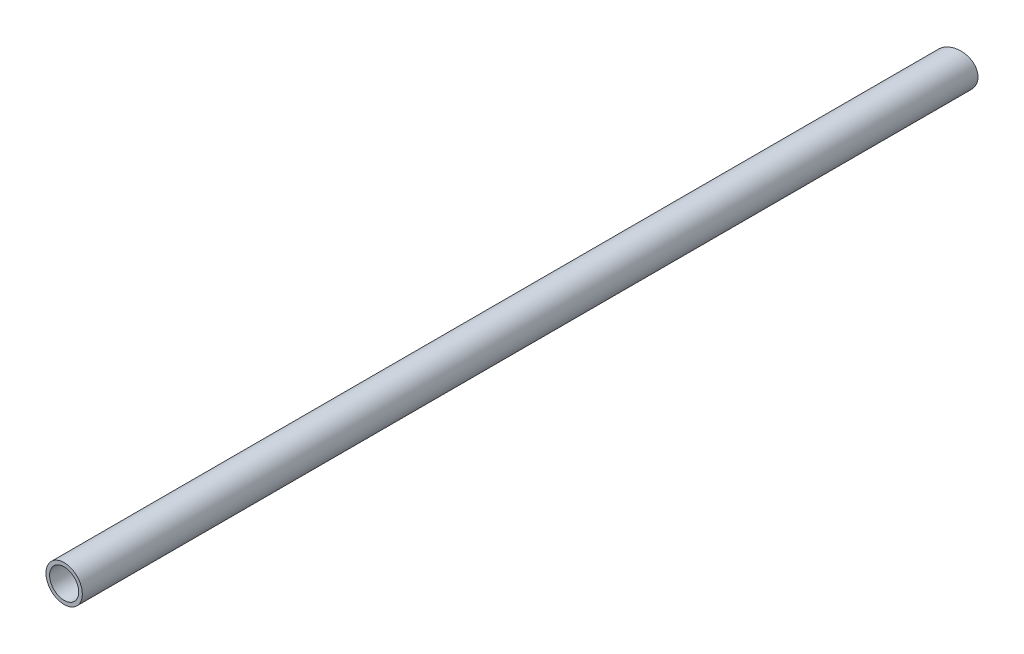
ISO-10303-21;
HEADER;
FILE_DESCRIPTION(('STEP AP214'),'2;1');
FILE_NAME('part.step','',(''),(''),'','','');
FILE_SCHEMA(('AUTOMOTIVE_DESIGN { 1 0 10303 214 1 1 1 1 }'));
ENDSEC;
DATA;
#1=APPLICATION_CONTEXT('core data for automotive mechanical design processes');
#2=APPLICATION_PROTOCOL_DEFINITION('international standard','automotive_design',2000,#1);
#3=PRODUCT_CONTEXT('',#1,'mechanical');
#4=PRODUCT('Part','Part','',(#3));
#5=PRODUCT_RELATED_PRODUCT_CATEGORY('part','',(#4));
#6=PRODUCT_DEFINITION_FORMATION('','',#4);
#7=PRODUCT_DEFINITION_CONTEXT('part definition',#1,'design');
#8=PRODUCT_DEFINITION('design','',#6,#7);
#9=PRODUCT_DEFINITION_SHAPE('','',#8);
#10=(LENGTH_UNIT() NAMED_UNIT(*) SI_UNIT(.MILLI.,.METRE.));
#11=(NAMED_UNIT(*) PLANE_ANGLE_UNIT() SI_UNIT($,.RADIAN.));
#12=(NAMED_UNIT(*) SI_UNIT($,.STERADIAN.) SOLID_ANGLE_UNIT());
#13=UNCERTAINTY_MEASURE_WITH_UNIT(LENGTH_MEASURE(1.E-05),#10,'distance_accuracy_value','');
#14=(GEOMETRIC_REPRESENTATION_CONTEXT(3) GLOBAL_UNCERTAINTY_ASSIGNED_CONTEXT((#13)) GLOBAL_UNIT_ASSIGNED_CONTEXT((#10,
#11,#12)) REPRESENTATION_CONTEXT('',''));
#15=CARTESIAN_POINT('',(0.,0.,0.));
#16=DIRECTION('',(0.,0.,1.));
#17=DIRECTION('',(1.,0.,0.));
#18=AXIS2_PLACEMENT_3D('',#15,#16,#17);
#19=CARTESIAN_POINT('',(0.,0.,782.32));
#20=DIRECTION('',(0.,0.,1.));
#21=DIRECTION('',(1.,0.,0.));
#22=AXIS2_PLACEMENT_3D('',#19,#20,#21);
#23=PLANE('',#22);
#24=CARTESIAN_POINT('',(0.,0.,782.32));
#25=DIRECTION('',(0.,0.,1.));
#26=DIRECTION('',(1.,0.,0.));
#27=AXIS2_PLACEMENT_3D('',#24,#25,#26);
#28=CIRCLE('',#27,15.875);
#29=CARTESIAN_POINT('',(15.875,0.,782.32));
#30=VERTEX_POINT('',#29);
#31=EDGE_CURVE('E10',#30,#30,#28,.T.);
#32=ORIENTED_EDGE('',*,*,#31,.T.);
#33=EDGE_LOOP('',(#32));
#34=FACE_BOUND('',#33,.T.);
#35=CARTESIAN_POINT('',(0.,0.,782.32));
#36=DIRECTION('',(0.,0.,1.));
#37=DIRECTION('',(1.,0.,0.));
#38=AXIS2_PLACEMENT_3D('',#35,#36,#37);
#39=CIRCLE('',#38,12.7);
#40=CARTESIAN_POINT('',(12.7,0.,782.32));
#41=VERTEX_POINT('',#40);
#42=EDGE_CURVE('E45',#41,#41,#39,.T.);
#43=ORIENTED_EDGE('',*,*,#42,.F.);
#44=EDGE_LOOP('',(#43));
#45=FACE_BOUND('',#44,.T.);
#46=ADVANCED_FACE('F37',(#34,#45),#23,.T.);
#47=CARTESIAN_POINT('',(0.,0.,782.32));
#48=DIRECTION('',(0.,0.,-1.));
#49=DIRECTION('',(-1.,0.,0.));
#50=AXIS2_PLACEMENT_3D('',#47,#48,#49);
#51=CYLINDRICAL_SURFACE('',#50,15.875);
#52=ORIENTED_EDGE('',*,*,#31,.F.);
#53=EDGE_LOOP('',(#52));
#54=FACE_BOUND('',#53,.T.);
#55=CARTESIAN_POINT('',(0.,0.,4.25369342984394));
#56=DIRECTION('',(0.258819045102515,0.,0.96592582628907));
#57=DIRECTION('',(0.96592582628907,0.,-0.258819045102515));
#58=AXIS2_PLACEMENT_3D('',#55,#56,#57);
#59=ELLIPSE('',#58,16.43500936401,15.875);
#60=CARTESIAN_POINT('',(15.875,0.,0.));
#61=VERTEX_POINT('',#60);
#62=EDGE_CURVE('E49',#61,#61,#59,.T.);
#63=ORIENTED_EDGE('',*,*,#62,.T.);
#64=EDGE_LOOP('',(#63));
#65=FACE_BOUND('',#64,.T.);
#66=ADVANCED_FACE('F39',(#54,#65),#51,.T.);
#67=CARTESIAN_POINT('',(0.,0.,782.32));
#68=DIRECTION('',(0.,0.,-1.));
#69=DIRECTION('',(-1.,0.,0.));
#70=AXIS2_PLACEMENT_3D('',#67,#68,#69);
#71=CYLINDRICAL_SURFACE('',#70,12.7);
#72=CARTESIAN_POINT('',(0.,0.,4.25369342984394));
#73=DIRECTION('',(0.258819045102515,0.,0.96592582628907));
#74=DIRECTION('',(0.96592582628907,0.,-0.258819045102515));
#75=AXIS2_PLACEMENT_3D('',#72,#73,#74);
#76=ELLIPSE('',#75,13.148007491208,12.7);
#77=CARTESIAN_POINT('',(12.7,0.,0.850738685968769));
#78=VERTEX_POINT('',#77);
#79=EDGE_CURVE('E41',#78,#78,#76,.T.);
#80=ORIENTED_EDGE('',*,*,#79,.F.);
#81=EDGE_LOOP('',(#80));
#82=FACE_BOUND('',#81,.T.);
#83=ORIENTED_EDGE('',*,*,#42,.T.);
#84=EDGE_LOOP('',(#83));
#85=FACE_BOUND('',#84,.T.);
#86=ADVANCED_FACE('F61',(#82,#85),#71,.F.);
#87=CARTESIAN_POINT('',(15.875,-15.875,0.));
#88=DIRECTION('',(0.258819045102515,0.,0.96592582628907));
#89=DIRECTION('',(0.96592582628907,0.,-0.258819045102515));
#90=AXIS2_PLACEMENT_3D('',#87,#88,#89);
#91=PLANE('',#90);
#92=ORIENTED_EDGE('',*,*,#79,.T.);
#93=EDGE_LOOP('',(#92));
#94=FACE_BOUND('',#93,.T.);
#95=ORIENTED_EDGE('',*,*,#62,.F.);
#96=EDGE_LOOP('',(#95));
#97=FACE_BOUND('',#96,.T.);
#98=ADVANCED_FACE('F58',(#94,#97),#91,.F.);
#99=CLOSED_SHELL('',(#46,#66,#86,#98));
#100=MANIFOLD_SOLID_BREP('B2',#99);
#101=ADVANCED_BREP_SHAPE_REPRESENTATION('',(#18,#100),#14);
#102=SHAPE_DEFINITION_REPRESENTATION(#9,#101);
ENDSEC;
END-ISO-10303-21;
